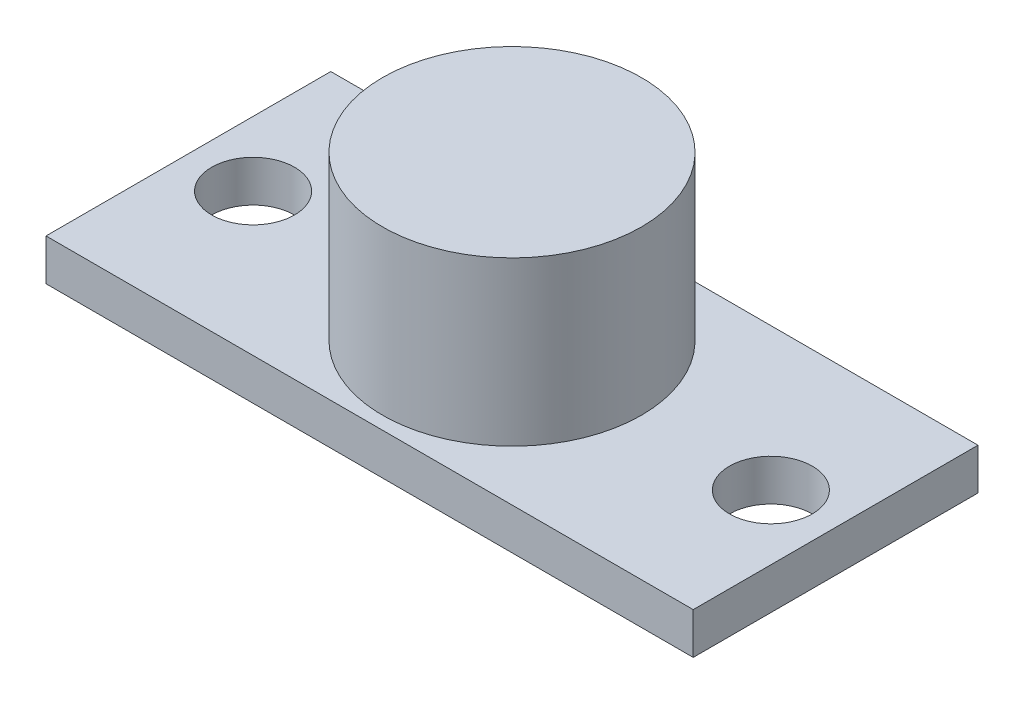
ISO-10303-21;
HEADER;
FILE_DESCRIPTION(('STEP AP214'),'2;1');
FILE_NAME('part.step','',(''),(''),'','','');
FILE_SCHEMA(('AUTOMOTIVE_DESIGN { 1 0 10303 214 1 1 1 1 }'));
ENDSEC;
DATA;
#1=APPLICATION_CONTEXT('core data for automotive mechanical design processes');
#2=APPLICATION_PROTOCOL_DEFINITION('international standard','automotive_design',2000,#1);
#3=PRODUCT_CONTEXT('',#1,'mechanical');
#4=PRODUCT('Part','Part','',(#3));
#5=PRODUCT_RELATED_PRODUCT_CATEGORY('part','',(#4));
#6=PRODUCT_DEFINITION_FORMATION('','',#4);
#7=PRODUCT_DEFINITION_CONTEXT('part definition',#1,'design');
#8=PRODUCT_DEFINITION('design','',#6,#7);
#9=PRODUCT_DEFINITION_SHAPE('','',#8);
#10=(LENGTH_UNIT() NAMED_UNIT(*) SI_UNIT(.MILLI.,.METRE.));
#11=(NAMED_UNIT(*) PLANE_ANGLE_UNIT() SI_UNIT($,.RADIAN.));
#12=(NAMED_UNIT(*) SI_UNIT($,.STERADIAN.) SOLID_ANGLE_UNIT());
#13=UNCERTAINTY_MEASURE_WITH_UNIT(LENGTH_MEASURE(1.E-05),#10,'distance_accuracy_value','');
#14=(GEOMETRIC_REPRESENTATION_CONTEXT(3) GLOBAL_UNCERTAINTY_ASSIGNED_CONTEXT((#13)) GLOBAL_UNIT_ASSIGNED_CONTEXT((#10,
#11,#12)) REPRESENTATION_CONTEXT('',''));
#15=CARTESIAN_POINT('',(0.,0.,0.));
#16=DIRECTION('',(0.,0.,1.));
#17=DIRECTION('',(1.,0.,0.));
#18=AXIS2_PLACEMENT_3D('',#15,#16,#17);
#19=CARTESIAN_POINT('',(-12.5,0.,-5.5));
#20=DIRECTION('',(-1.,0.,0.));
#21=DIRECTION('',(0.,0.,1.));
#22=AXIS2_PLACEMENT_3D('',#19,#20,#21);
#23=PLANE('',#22);
#24=DIRECTION('',(0.,0.,-1.));
#25=VECTOR('',#24,1.);
#26=CARTESIAN_POINT('',(-12.5,1.6,-2.75));
#27=LINE('',#26,#25);
#28=CARTESIAN_POINT('',(-12.5,1.6,5.5));
#29=VERTEX_POINT('',#28);
#30=CARTESIAN_POINT('',(-12.5,1.6,-5.5));
#31=VERTEX_POINT('',#30);
#32=EDGE_CURVE('E10',#29,#31,#27,.T.);
#33=ORIENTED_EDGE('',*,*,#32,.T.);
#34=DIRECTION('',(0.,1.,0.));
#35=VECTOR('',#34,1.);
#36=CARTESIAN_POINT('',(-12.5,0.,-5.5));
#37=LINE('',#36,#35);
#38=CARTESIAN_POINT('',(-12.5,0.,-5.5));
#39=VERTEX_POINT('',#38);
#40=EDGE_CURVE('E34',#39,#31,#37,.T.);
#41=ORIENTED_EDGE('',*,*,#40,.F.);
#42=DIRECTION('',(0.,0.,1.));
#43=VECTOR('',#42,1.);
#44=CARTESIAN_POINT('',(-12.5,0.,-2.75));
#45=LINE('',#44,#43);
#46=CARTESIAN_POINT('',(-12.5,0.,5.5));
#47=VERTEX_POINT('',#46);
#48=EDGE_CURVE('E25',#39,#47,#45,.T.);
#49=ORIENTED_EDGE('',*,*,#48,.T.);
#50=DIRECTION('',(0.,1.,0.));
#51=VECTOR('',#50,1.);
#52=CARTESIAN_POINT('',(-12.5,0.,5.5));
#53=LINE('',#52,#51);
#54=EDGE_CURVE('E80',#47,#29,#53,.T.);
#55=ORIENTED_EDGE('',*,*,#54,.T.);
#56=EDGE_LOOP('',(#33,#41,#49,#55));
#57=FACE_BOUND('',#56,.T.);
#58=ADVANCED_FACE('F15',(#57),#23,.T.);
#59=CARTESIAN_POINT('',(12.5,0.,-5.5));
#60=DIRECTION('',(0.,0.,-1.));
#61=DIRECTION('',(-1.,0.,0.));
#62=AXIS2_PLACEMENT_3D('',#59,#60,#61);
#63=PLANE('',#62);
#64=DIRECTION('',(1.,0.,0.));
#65=VECTOR('',#64,1.);
#66=CARTESIAN_POINT('',(13.75,1.6,-5.5));
#67=LINE('',#66,#65);
#68=CARTESIAN_POINT('',(12.5,1.6,-5.5));
#69=VERTEX_POINT('',#68);
#70=EDGE_CURVE('E89',#31,#69,#67,.T.);
#71=ORIENTED_EDGE('',*,*,#70,.T.);
#72=DIRECTION('',(0.,1.,0.));
#73=VECTOR('',#72,1.);
#74=CARTESIAN_POINT('',(12.5,0.,-5.5));
#75=LINE('',#74,#73);
#76=CARTESIAN_POINT('',(12.5,0.,-5.5));
#77=VERTEX_POINT('',#76);
#78=EDGE_CURVE('E76',#77,#69,#75,.T.);
#79=ORIENTED_EDGE('',*,*,#78,.F.);
#80=DIRECTION('',(-1.,0.,0.));
#81=VECTOR('',#80,1.);
#82=CARTESIAN_POINT('',(6.25,0.,-5.5));
#83=LINE('',#82,#81);
#84=EDGE_CURVE('E112',#77,#39,#83,.T.);
#85=ORIENTED_EDGE('',*,*,#84,.T.);
#86=ORIENTED_EDGE('',*,*,#40,.T.);
#87=EDGE_LOOP('',(#71,#79,#85,#86));
#88=FACE_BOUND('',#87,.T.);
#89=ADVANCED_FACE('F17',(#88),#63,.T.);
#90=CARTESIAN_POINT('',(10.,0.,0.));
#91=DIRECTION('',(0.,-1.,0.));
#92=DIRECTION('',(1.,0.,0.));
#93=AXIS2_PLACEMENT_3D('',#90,#91,#92);
#94=CYLINDRICAL_SURFACE('',#93,1.6);
#95=CARTESIAN_POINT('',(10.,1.6,0.));
#96=DIRECTION('',(0.,1.,0.));
#97=DIRECTION('',(1.,0.,0.));
#98=AXIS2_PLACEMENT_3D('',#95,#96,#97);
#99=CIRCLE('',#98,1.6);
#100=CARTESIAN_POINT('',(8.4,1.6,0.));
#101=VERTEX_POINT('',#100);
#102=EDGE_CURVE('E113',#101,#101,#99,.T.);
#103=ORIENTED_EDGE('',*,*,#102,.T.);
#104=EDGE_LOOP('',(#103));
#105=FACE_BOUND('',#104,.T.);
#106=CARTESIAN_POINT('',(10.,0.,0.));
#107=DIRECTION('',(0.,-1.,0.));
#108=DIRECTION('',(1.,0.,0.));
#109=AXIS2_PLACEMENT_3D('',#106,#107,#108);
#110=CIRCLE('',#109,1.6);
#111=CARTESIAN_POINT('',(8.4,0.,0.));
#112=VERTEX_POINT('',#111);
#113=EDGE_CURVE('E123',#112,#112,#110,.T.);
#114=ORIENTED_EDGE('',*,*,#113,.T.);
#115=EDGE_LOOP('',(#114));
#116=FACE_BOUND('',#115,.T.);
#117=ADVANCED_FACE('F148',(#105,#116),#94,.F.);
#118=CARTESIAN_POINT('',(-10.,0.,0.));
#119=DIRECTION('',(0.,-1.,0.));
#120=DIRECTION('',(1.,0.,0.));
#121=AXIS2_PLACEMENT_3D('',#118,#119,#120);
#122=CYLINDRICAL_SURFACE('',#121,1.6);
#123=CARTESIAN_POINT('',(-10.,1.6,0.));
#124=DIRECTION('',(0.,1.,0.));
#125=DIRECTION('',(1.,0.,0.));
#126=AXIS2_PLACEMENT_3D('',#123,#124,#125);
#127=CIRCLE('',#126,1.6);
#128=CARTESIAN_POINT('',(-11.6,1.6,0.));
#129=VERTEX_POINT('',#128);
#130=EDGE_CURVE('E19',#129,#129,#127,.T.);
#131=ORIENTED_EDGE('',*,*,#130,.T.);
#132=EDGE_LOOP('',(#131));
#133=FACE_BOUND('',#132,.T.);
#134=CARTESIAN_POINT('',(-10.,0.,0.));
#135=DIRECTION('',(0.,-1.,0.));
#136=DIRECTION('',(1.,0.,0.));
#137=AXIS2_PLACEMENT_3D('',#134,#135,#136);
#138=CIRCLE('',#137,1.6);
#139=CARTESIAN_POINT('',(-11.6,0.,0.));
#140=VERTEX_POINT('',#139);
#141=EDGE_CURVE('E106',#140,#140,#138,.T.);
#142=ORIENTED_EDGE('',*,*,#141,.T.);
#143=EDGE_LOOP('',(#142));
#144=FACE_BOUND('',#143,.T.);
#145=ADVANCED_FACE('F151',(#133,#144),#122,.F.);
#146=CARTESIAN_POINT('',(12.5,0.,5.5));
#147=DIRECTION('',(1.,0.,0.));
#148=DIRECTION('',(0.,0.,-1.));
#149=AXIS2_PLACEMENT_3D('',#146,#147,#148);
#150=PLANE('',#149);
#151=DIRECTION('',(0.,0.,1.));
#152=VECTOR('',#151,1.);
#153=CARTESIAN_POINT('',(12.5,1.6,2.75));
#154=LINE('',#153,#152);
#155=CARTESIAN_POINT('',(12.5,1.6,5.5));
#156=VERTEX_POINT('',#155);
#157=EDGE_CURVE('E114',#69,#156,#154,.T.);
#158=ORIENTED_EDGE('',*,*,#157,.T.);
#159=DIRECTION('',(0.,1.,0.));
#160=VECTOR('',#159,1.);
#161=CARTESIAN_POINT('',(12.5,0.,5.5));
#162=LINE('',#161,#160);
#163=CARTESIAN_POINT('',(12.5,0.,5.5));
#164=VERTEX_POINT('',#163);
#165=EDGE_CURVE('E98',#164,#156,#162,.T.);
#166=ORIENTED_EDGE('',*,*,#165,.F.);
#167=DIRECTION('',(0.,0.,-1.));
#168=VECTOR('',#167,1.);
#169=CARTESIAN_POINT('',(12.5,0.,2.75));
#170=LINE('',#169,#168);
#171=EDGE_CURVE('E102',#164,#77,#170,.T.);
#172=ORIENTED_EDGE('',*,*,#171,.T.);
#173=ORIENTED_EDGE('',*,*,#78,.T.);
#174=EDGE_LOOP('',(#158,#166,#172,#173));
#175=FACE_BOUND('',#174,.T.);
#176=ADVANCED_FACE('F154',(#175),#150,.T.);
#177=CARTESIAN_POINT('',(-12.5,0.,5.5));
#178=DIRECTION('',(0.,0.,1.));
#179=DIRECTION('',(1.,0.,0.));
#180=AXIS2_PLACEMENT_3D('',#177,#178,#179);
#181=PLANE('',#180);
#182=DIRECTION('',(-1.,0.,0.));
#183=VECTOR('',#182,1.);
#184=CARTESIAN_POINT('',(1.25,1.6,5.5));
#185=LINE('',#184,#183);
#186=EDGE_CURVE('E96',#156,#29,#185,.T.);
#187=ORIENTED_EDGE('',*,*,#186,.T.);
#188=ORIENTED_EDGE('',*,*,#54,.F.);
#189=DIRECTION('',(1.,0.,0.));
#190=VECTOR('',#189,1.);
#191=CARTESIAN_POINT('',(-6.25,0.,5.5));
#192=LINE('',#191,#190);
#193=EDGE_CURVE('E99',#47,#164,#192,.T.);
#194=ORIENTED_EDGE('',*,*,#193,.T.);
#195=ORIENTED_EDGE('',*,*,#165,.T.);
#196=EDGE_LOOP('',(#187,#188,#194,#195));
#197=FACE_BOUND('',#196,.T.);
#198=ADVANCED_FACE('F97',(#197),#181,.T.);
#199=CARTESIAN_POINT('',(15.,1.6,0.));
#200=DIRECTION('',(0.,1.,0.));
#201=DIRECTION('',(0.,0.,1.));
#202=AXIS2_PLACEMENT_3D('',#199,#200,#201);
#203=PLANE('',#202);
#204=CARTESIAN_POINT('',(0.,1.6,0.));
#205=DIRECTION('',(0.,-1.,0.));
#206=DIRECTION('',(1.,0.,0.));
#207=AXIS2_PLACEMENT_3D('',#204,#205,#206);
#208=CIRCLE('',#207,5.);
#209=CARTESIAN_POINT('',(5.,1.6,0.));
#210=VERTEX_POINT('',#209);
#211=EDGE_CURVE('E60',#210,#210,#208,.T.);
#212=ORIENTED_EDGE('',*,*,#211,.T.);
#213=EDGE_LOOP('',(#212));
#214=FACE_BOUND('',#213,.T.);
#215=ORIENTED_EDGE('',*,*,#157,.F.);
#216=ORIENTED_EDGE('',*,*,#70,.F.);
#217=ORIENTED_EDGE('',*,*,#32,.F.);
#218=ORIENTED_EDGE('',*,*,#186,.F.);
#219=EDGE_LOOP('',(#215,#216,#217,#218));
#220=FACE_BOUND('',#219,.T.);
#221=ORIENTED_EDGE('',*,*,#130,.F.);
#222=EDGE_LOOP('',(#221));
#223=FACE_BOUND('',#222,.T.);
#224=ORIENTED_EDGE('',*,*,#102,.F.);
#225=EDGE_LOOP('',(#224));
#226=FACE_BOUND('',#225,.T.);
#227=ADVANCED_FACE('F94',(#214,#220,#223,#226),#203,.T.);
#228=CARTESIAN_POINT('',(0.,0.,0.));
#229=DIRECTION('',(0.,-1.,0.));
#230=DIRECTION('',(0.,0.,-1.));
#231=AXIS2_PLACEMENT_3D('',#228,#229,#230);
#232=PLANE('',#231);
#233=ORIENTED_EDGE('',*,*,#171,.F.);
#234=ORIENTED_EDGE('',*,*,#193,.F.);
#235=ORIENTED_EDGE('',*,*,#48,.F.);
#236=ORIENTED_EDGE('',*,*,#84,.F.);
#237=EDGE_LOOP('',(#233,#234,#235,#236));
#238=FACE_BOUND('',#237,.T.);
#239=ORIENTED_EDGE('',*,*,#141,.F.);
#240=EDGE_LOOP('',(#239));
#241=FACE_BOUND('',#240,.T.);
#242=ORIENTED_EDGE('',*,*,#113,.F.);
#243=EDGE_LOOP('',(#242));
#244=FACE_BOUND('',#243,.T.);
#245=ADVANCED_FACE('F132',(#238,#241,#244),#232,.T.);
#246=CARTESIAN_POINT('',(0.,4.75,0.));
#247=DIRECTION('',(0.,1.,0.));
#248=DIRECTION('',(1.,0.,0.));
#249=AXIS2_PLACEMENT_3D('',#246,#247,#248);
#250=CYLINDRICAL_SURFACE('',#249,5.);
#251=CARTESIAN_POINT('',(0.,7.9,0.));
#252=DIRECTION('',(0.,-1.,0.));
#253=DIRECTION('',(1.,0.,0.));
#254=AXIS2_PLACEMENT_3D('',#251,#252,#253);
#255=CIRCLE('',#254,5.);
#256=CARTESIAN_POINT('',(5.,7.9,0.));
#257=VERTEX_POINT('',#256);
#258=EDGE_CURVE('E55',#257,#257,#255,.T.);
#259=ORIENTED_EDGE('',*,*,#258,.T.);
#260=EDGE_LOOP('',(#259));
#261=FACE_BOUND('',#260,.T.);
#262=ORIENTED_EDGE('',*,*,#211,.F.);
#263=EDGE_LOOP('',(#262));
#264=FACE_BOUND('',#263,.T.);
#265=ADVANCED_FACE('F129',(#261,#264),#250,.T.);
#266=CARTESIAN_POINT('',(5.,7.9,0.));
#267=DIRECTION('',(0.,1.,0.));
#268=DIRECTION('',(0.,0.,1.));
#269=AXIS2_PLACEMENT_3D('',#266,#267,#268);
#270=PLANE('',#269);
#271=ORIENTED_EDGE('',*,*,#258,.F.);
#272=EDGE_LOOP('',(#271));
#273=FACE_BOUND('',#272,.T.);
#274=ADVANCED_FACE('F131',(#273),#270,.T.);
#275=CLOSED_SHELL('',(#58,#89,#117,#145,#176,#198,#227,#245,#265,#274));
#276=MANIFOLD_SOLID_BREP('B1',#275);
#277=ADVANCED_BREP_SHAPE_REPRESENTATION('',(#18,#276),#14);
#278=SHAPE_DEFINITION_REPRESENTATION(#9,#277);
ENDSEC;
END-ISO-10303-21;
